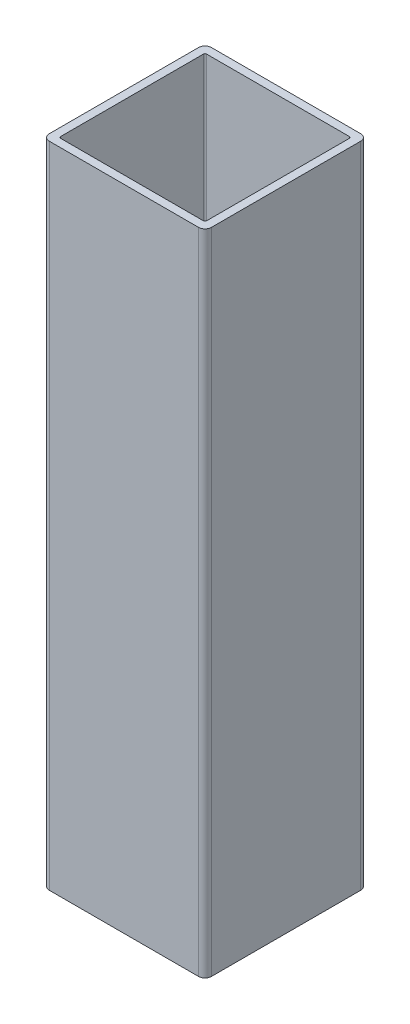
ISO-10303-21;
HEADER;
FILE_DESCRIPTION(('STEP AP214'),'2;1');
FILE_NAME('part.step','',(''),(''),'','','');
FILE_SCHEMA(('AUTOMOTIVE_DESIGN { 1 0 10303 214 1 1 1 1 }'));
ENDSEC;
DATA;
#1=APPLICATION_CONTEXT('core data for automotive mechanical design processes');
#2=APPLICATION_PROTOCOL_DEFINITION('international standard','automotive_design',2000,#1);
#3=PRODUCT_CONTEXT('',#1,'mechanical');
#4=PRODUCT('Part','Part','',(#3));
#5=PRODUCT_RELATED_PRODUCT_CATEGORY('part','',(#4));
#6=PRODUCT_DEFINITION_FORMATION('','',#4);
#7=PRODUCT_DEFINITION_CONTEXT('part definition',#1,'design');
#8=PRODUCT_DEFINITION('design','',#6,#7);
#9=PRODUCT_DEFINITION_SHAPE('','',#8);
#10=(LENGTH_UNIT() NAMED_UNIT(*) SI_UNIT(.MILLI.,.METRE.));
#11=(NAMED_UNIT(*) PLANE_ANGLE_UNIT() SI_UNIT($,.RADIAN.));
#12=(NAMED_UNIT(*) SI_UNIT($,.STERADIAN.) SOLID_ANGLE_UNIT());
#13=UNCERTAINTY_MEASURE_WITH_UNIT(LENGTH_MEASURE(1.E-05),#10,'distance_accuracy_value','');
#14=(GEOMETRIC_REPRESENTATION_CONTEXT(3) GLOBAL_UNCERTAINTY_ASSIGNED_CONTEXT((#13)) GLOBAL_UNIT_ASSIGNED_CONTEXT((#10,
#11,#12)) REPRESENTATION_CONTEXT('',''));
#15=CARTESIAN_POINT('',(0.,0.,0.));
#16=DIRECTION('',(0.,0.,1.));
#17=DIRECTION('',(1.,0.,0.));
#18=AXIS2_PLACEMENT_3D('',#15,#16,#17);
#19=CARTESIAN_POINT('',(358.3,100.,925.));
#20=DIRECTION('',(0.,1.,0.));
#21=DIRECTION('',(0.,0.,1.));
#22=AXIS2_PLACEMENT_3D('',#19,#20,#21);
#23=PLANE('',#22);
#24=DIRECTION('',(-1.,0.,0.));
#25=VECTOR('',#24,1.);
#26=CARTESIAN_POINT('',(358.3,100.,-482.5));
#27=LINE('',#26,#25);
#28=CARTESIAN_POINT('',(-364.3,100.,-482.5));
#29=VERTEX_POINT('',#28);
#30=CARTESIAN_POINT('',(-452.3,100.,-482.5));
#31=VERTEX_POINT('',#30);
#32=EDGE_CURVE('E299',#29,#31,#27,.T.);
#33=ORIENTED_EDGE('',*,*,#32,.T.);
#34=CARTESIAN_POINT('',(-452.3,100.,-481.5));
#35=DIRECTION('',(0.,1.,0.));
#36=DIRECTION('',(0.,0.,1.));
#37=AXIS2_PLACEMENT_3D('',#34,#35,#36);
#38=CIRCLE('',#37,1.);
#39=CARTESIAN_POINT('',(-453.3,100.,-481.5));
#40=VERTEX_POINT('',#39);
#41=EDGE_CURVE('E200',#31,#40,#38,.T.);
#42=ORIENTED_EDGE('',*,*,#41,.T.);
#43=DIRECTION('',(0.,0.,1.));
#44=VECTOR('',#43,1.);
#45=CARTESIAN_POINT('',(-453.3,100.,925.));
#46=LINE('',#45,#44);
#47=CARTESIAN_POINT('',(-453.3,100.,-393.5));
#48=VERTEX_POINT('',#47);
#49=EDGE_CURVE('E374',#40,#48,#46,.T.);
#50=ORIENTED_EDGE('',*,*,#49,.T.);
#51=CARTESIAN_POINT('',(-452.3,100.,-393.5));
#52=DIRECTION('',(0.,1.,0.));
#53=DIRECTION('',(0.,0.,1.));
#54=AXIS2_PLACEMENT_3D('',#51,#52,#53);
#55=CIRCLE('',#54,1.);
#56=CARTESIAN_POINT('',(-452.3,100.,-392.5));
#57=VERTEX_POINT('',#56);
#58=EDGE_CURVE('E27',#48,#57,#55,.T.);
#59=ORIENTED_EDGE('',*,*,#58,.T.);
#60=DIRECTION('',(1.,0.,0.));
#61=VECTOR('',#60,1.);
#62=CARTESIAN_POINT('',(358.3,100.,-392.5));
#63=LINE('',#62,#61);
#64=CARTESIAN_POINT('',(-364.3,100.,-392.5));
#65=VERTEX_POINT('',#64);
#66=EDGE_CURVE('E295',#57,#65,#63,.T.);
#67=ORIENTED_EDGE('',*,*,#66,.T.);
#68=CARTESIAN_POINT('',(-364.3,100.,-393.5));
#69=DIRECTION('',(0.,1.,0.));
#70=DIRECTION('',(0.,0.,1.));
#71=AXIS2_PLACEMENT_3D('',#68,#69,#70);
#72=CIRCLE('',#71,1.);
#73=CARTESIAN_POINT('',(-363.3,100.,-393.5));
#74=VERTEX_POINT('',#73);
#75=EDGE_CURVE('E34',#65,#74,#72,.T.);
#76=ORIENTED_EDGE('',*,*,#75,.T.);
#77=DIRECTION('',(0.,0.,-1.));
#78=VECTOR('',#77,1.);
#79=CARTESIAN_POINT('',(-363.3,100.,925.));
#80=LINE('',#79,#78);
#81=CARTESIAN_POINT('',(-363.3,100.,-481.5));
#82=VERTEX_POINT('',#81);
#83=EDGE_CURVE('E296',#74,#82,#80,.T.);
#84=ORIENTED_EDGE('',*,*,#83,.T.);
#85=CARTESIAN_POINT('',(-364.3,100.,-481.5));
#86=DIRECTION('',(0.,1.,0.));
#87=DIRECTION('',(0.,0.,1.));
#88=AXIS2_PLACEMENT_3D('',#85,#86,#87);
#89=CIRCLE('',#88,1.);
#90=EDGE_CURVE('E204',#82,#29,#89,.T.);
#91=ORIENTED_EDGE('',*,*,#90,.T.);
#92=EDGE_LOOP('',(#33,#42,#50,#59,#67,#76,#84,#91));
#93=FACE_BOUND('',#92,.T.);
#94=DIRECTION('',(1.,0.,0.));
#95=VECTOR('',#94,1.);
#96=CARTESIAN_POINT('',(-458.3,100.,-487.5));
#97=LINE('',#96,#95);
#98=CARTESIAN_POINT('',(-454.3,100.,-487.5));
#99=VERTEX_POINT('',#98);
#100=CARTESIAN_POINT('',(-362.3,100.,-487.5));
#101=VERTEX_POINT('',#100);
#102=EDGE_CURVE('E137',#99,#101,#97,.T.);
#103=ORIENTED_EDGE('',*,*,#102,.T.);
#104=CARTESIAN_POINT('',(-362.3,100.,-483.5));
#105=DIRECTION('',(0.,1.,0.));
#106=DIRECTION('',(0.,0.,1.));
#107=AXIS2_PLACEMENT_3D('',#104,#105,#106);
#108=CIRCLE('',#107,4.);
#109=CARTESIAN_POINT('',(-358.3,100.,-483.5));
#110=VERTEX_POINT('',#109);
#111=EDGE_CURVE('E133',#101,#110,#108,.F.);
#112=ORIENTED_EDGE('',*,*,#111,.T.);
#113=DIRECTION('',(0.,0.,1.));
#114=VECTOR('',#113,1.);
#115=CARTESIAN_POINT('',(-358.3,100.,-387.5));
#116=LINE('',#115,#114);
#117=CARTESIAN_POINT('',(-358.3,100.,-391.5));
#118=VERTEX_POINT('',#117);
#119=EDGE_CURVE('E135',#110,#118,#116,.T.);
#120=ORIENTED_EDGE('',*,*,#119,.T.);
#121=CARTESIAN_POINT('',(-362.3,100.,-391.5));
#122=DIRECTION('',(0.,1.,0.));
#123=DIRECTION('',(0.,0.,1.));
#124=AXIS2_PLACEMENT_3D('',#121,#122,#123);
#125=CIRCLE('',#124,4.);
#126=CARTESIAN_POINT('',(-362.3,100.,-387.5));
#127=VERTEX_POINT('',#126);
#128=EDGE_CURVE('E326',#118,#127,#125,.F.);
#129=ORIENTED_EDGE('',*,*,#128,.T.);
#130=DIRECTION('',(-1.,0.,0.));
#131=VECTOR('',#130,1.);
#132=CARTESIAN_POINT('',(-458.3,100.,-387.5));
#133=LINE('',#132,#131);
#134=CARTESIAN_POINT('',(-454.3,100.,-387.5));
#135=VERTEX_POINT('',#134);
#136=EDGE_CURVE('E154',#127,#135,#133,.T.);
#137=ORIENTED_EDGE('',*,*,#136,.T.);
#138=CARTESIAN_POINT('',(-454.3,100.,-391.5));
#139=DIRECTION('',(0.,1.,0.));
#140=DIRECTION('',(0.,0.,1.));
#141=AXIS2_PLACEMENT_3D('',#138,#139,#140);
#142=CIRCLE('',#141,4.);
#143=CARTESIAN_POINT('',(-458.3,100.,-391.5));
#144=VERTEX_POINT('',#143);
#145=EDGE_CURVE('E321',#135,#144,#142,.F.);
#146=ORIENTED_EDGE('',*,*,#145,.T.);
#147=DIRECTION('',(0.,0.,1.));
#148=VECTOR('',#147,1.);
#149=CARTESIAN_POINT('',(-458.3,100.,-387.5));
#150=LINE('',#149,#148);
#151=CARTESIAN_POINT('',(-458.3,100.,-483.5));
#152=VERTEX_POINT('',#151);
#153=EDGE_CURVE('E153',#152,#144,#150,.T.);
#154=ORIENTED_EDGE('',*,*,#153,.F.);
#155=CARTESIAN_POINT('',(-454.3,100.,-483.5));
#156=DIRECTION('',(0.,1.,0.));
#157=DIRECTION('',(0.,0.,1.));
#158=AXIS2_PLACEMENT_3D('',#155,#156,#157);
#159=CIRCLE('',#158,4.);
#160=EDGE_CURVE('E142',#152,#99,#159,.F.);
#161=ORIENTED_EDGE('',*,*,#160,.T.);
#162=EDGE_LOOP('',(#103,#112,#120,#129,#137,#146,#154,#161));
#163=FACE_BOUND('',#162,.T.);
#164=ADVANCED_FACE('F19',(#93,#163),#23,.F.);
#165=CARTESIAN_POINT('',(-358.3,500.,825.));
#166=DIRECTION('',(0.,-1.,0.));
#167=DIRECTION('',(0.,0.,-1.));
#168=AXIS2_PLACEMENT_3D('',#165,#166,#167);
#169=PLANE('',#168);
#170=DIRECTION('',(1.,0.,0.));
#171=VECTOR('',#170,1.);
#172=CARTESIAN_POINT('',(-358.3,500.,-482.5));
#173=LINE('',#172,#171);
#174=CARTESIAN_POINT('',(-452.3,500.,-482.5));
#175=VERTEX_POINT('',#174);
#176=CARTESIAN_POINT('',(-364.3,500.,-482.5));
#177=VERTEX_POINT('',#176);
#178=EDGE_CURVE('E270',#175,#177,#173,.T.);
#179=ORIENTED_EDGE('',*,*,#178,.T.);
#180=CARTESIAN_POINT('',(-364.3,500.,-481.5));
#181=DIRECTION('',(0.,-1.,0.));
#182=DIRECTION('',(0.,0.,-1.));
#183=AXIS2_PLACEMENT_3D('',#180,#181,#182);
#184=CIRCLE('',#183,1.);
#185=CARTESIAN_POINT('',(-363.3,500.,-481.5));
#186=VERTEX_POINT('',#185);
#187=EDGE_CURVE('E206',#177,#186,#184,.T.);
#188=ORIENTED_EDGE('',*,*,#187,.T.);
#189=DIRECTION('',(0.,0.,1.));
#190=VECTOR('',#189,1.);
#191=CARTESIAN_POINT('',(-363.3,500.,825.));
#192=LINE('',#191,#190);
#193=CARTESIAN_POINT('',(-363.3,500.,-393.5));
#194=VERTEX_POINT('',#193);
#195=EDGE_CURVE('E220',#186,#194,#192,.T.);
#196=ORIENTED_EDGE('',*,*,#195,.T.);
#197=CARTESIAN_POINT('',(-364.3,500.,-393.5));
#198=DIRECTION('',(0.,-1.,0.));
#199=DIRECTION('',(0.,0.,-1.));
#200=AXIS2_PLACEMENT_3D('',#197,#198,#199);
#201=CIRCLE('',#200,1.);
#202=CARTESIAN_POINT('',(-364.3,500.,-392.5));
#203=VERTEX_POINT('',#202);
#204=EDGE_CURVE('E209',#194,#203,#201,.T.);
#205=ORIENTED_EDGE('',*,*,#204,.T.);
#206=DIRECTION('',(-1.,0.,0.));
#207=VECTOR('',#206,1.);
#208=CARTESIAN_POINT('',(-358.3,500.,-392.5));
#209=LINE('',#208,#207);
#210=CARTESIAN_POINT('',(-452.3,500.,-392.5));
#211=VERTEX_POINT('',#210);
#212=EDGE_CURVE('E162',#203,#211,#209,.T.);
#213=ORIENTED_EDGE('',*,*,#212,.T.);
#214=CARTESIAN_POINT('',(-452.3,500.,-393.5));
#215=DIRECTION('',(0.,-1.,0.));
#216=DIRECTION('',(0.,0.,-1.));
#217=AXIS2_PLACEMENT_3D('',#214,#215,#216);
#218=CIRCLE('',#217,1.);
#219=CARTESIAN_POINT('',(-453.3,500.,-393.5));
#220=VERTEX_POINT('',#219);
#221=EDGE_CURVE('E12',#211,#220,#218,.T.);
#222=ORIENTED_EDGE('',*,*,#221,.T.);
#223=DIRECTION('',(0.,0.,-1.));
#224=VECTOR('',#223,1.);
#225=CARTESIAN_POINT('',(-453.3,500.,825.));
#226=LINE('',#225,#224);
#227=CARTESIAN_POINT('',(-453.3,500.,-481.5));
#228=VERTEX_POINT('',#227);
#229=EDGE_CURVE('E273',#220,#228,#226,.T.);
#230=ORIENTED_EDGE('',*,*,#229,.T.);
#231=CARTESIAN_POINT('',(-452.3,500.,-481.5));
#232=DIRECTION('',(0.,-1.,0.));
#233=DIRECTION('',(0.,0.,-1.));
#234=AXIS2_PLACEMENT_3D('',#231,#232,#233);
#235=CIRCLE('',#234,1.);
#236=EDGE_CURVE('E202',#228,#175,#235,.T.);
#237=ORIENTED_EDGE('',*,*,#236,.T.);
#238=EDGE_LOOP('',(#179,#188,#196,#205,#213,#222,#230,#237));
#239=FACE_BOUND('',#238,.T.);
#240=DIRECTION('',(0.,0.,1.));
#241=VECTOR('',#240,1.);
#242=CARTESIAN_POINT('',(-358.3,500.,0.));
#243=LINE('',#242,#241);
#244=CARTESIAN_POINT('',(-358.3,500.,-483.5));
#245=VERTEX_POINT('',#244);
#246=CARTESIAN_POINT('',(-358.3,500.,-391.5));
#247=VERTEX_POINT('',#246);
#248=EDGE_CURVE('E310',#245,#247,#243,.T.);
#249=ORIENTED_EDGE('',*,*,#248,.F.);
#250=CARTESIAN_POINT('',(-362.3,500.,-483.5));
#251=DIRECTION('',(0.,-1.,0.));
#252=DIRECTION('',(0.,0.,-1.));
#253=AXIS2_PLACEMENT_3D('',#250,#251,#252);
#254=CIRCLE('',#253,4.);
#255=CARTESIAN_POINT('',(-362.3,500.,-487.5));
#256=VERTEX_POINT('',#255);
#257=EDGE_CURVE('E157',#245,#256,#254,.F.);
#258=ORIENTED_EDGE('',*,*,#257,.T.);
#259=DIRECTION('',(1.,0.,0.));
#260=VECTOR('',#259,1.);
#261=CARTESIAN_POINT('',(0.,500.,-487.5));
#262=LINE('',#261,#260);
#263=CARTESIAN_POINT('',(-454.3,500.,-487.5));
#264=VERTEX_POINT('',#263);
#265=EDGE_CURVE('E304',#264,#256,#262,.T.);
#266=ORIENTED_EDGE('',*,*,#265,.F.);
#267=CARTESIAN_POINT('',(-454.3,500.,-483.5));
#268=DIRECTION('',(0.,-1.,0.));
#269=DIRECTION('',(0.,0.,-1.));
#270=AXIS2_PLACEMENT_3D('',#267,#268,#269);
#271=CIRCLE('',#270,4.);
#272=CARTESIAN_POINT('',(-458.3,500.,-483.5));
#273=VERTEX_POINT('',#272);
#274=EDGE_CURVE('E334',#264,#273,#271,.F.);
#275=ORIENTED_EDGE('',*,*,#274,.T.);
#276=DIRECTION('',(0.,0.,1.));
#277=VECTOR('',#276,1.);
#278=CARTESIAN_POINT('',(-458.3,500.,0.));
#279=LINE('',#278,#277);
#280=CARTESIAN_POINT('',(-458.3,500.,-391.5));
#281=VERTEX_POINT('',#280);
#282=EDGE_CURVE('E280',#281,#273,#279,.F.);
#283=ORIENTED_EDGE('',*,*,#282,.F.);
#284=CARTESIAN_POINT('',(-454.3,500.,-391.5));
#285=DIRECTION('',(0.,-1.,0.));
#286=DIRECTION('',(0.,0.,-1.));
#287=AXIS2_PLACEMENT_3D('',#284,#285,#286);
#288=CIRCLE('',#287,4.);
#289=CARTESIAN_POINT('',(-454.3,500.,-387.5));
#290=VERTEX_POINT('',#289);
#291=EDGE_CURVE('E160',#281,#290,#288,.F.);
#292=ORIENTED_EDGE('',*,*,#291,.T.);
#293=DIRECTION('',(1.,0.,0.));
#294=VECTOR('',#293,1.);
#295=CARTESIAN_POINT('',(0.,500.,-387.5));
#296=LINE('',#295,#294);
#297=CARTESIAN_POINT('',(-362.3,500.,-387.5));
#298=VERTEX_POINT('',#297);
#299=EDGE_CURVE('E308',#298,#290,#296,.F.);
#300=ORIENTED_EDGE('',*,*,#299,.F.);
#301=CARTESIAN_POINT('',(-362.3,500.,-391.5));
#302=DIRECTION('',(0.,-1.,0.));
#303=DIRECTION('',(0.,0.,-1.));
#304=AXIS2_PLACEMENT_3D('',#301,#302,#303);
#305=CIRCLE('',#304,4.);
#306=EDGE_CURVE('E158',#298,#247,#305,.F.);
#307=ORIENTED_EDGE('',*,*,#306,.T.);
#308=EDGE_LOOP('',(#249,#258,#266,#275,#283,#292,#300,#307));
#309=FACE_BOUND('',#308,.T.);
#310=ADVANCED_FACE('F216',(#239,#309),#169,.F.);
#311=CARTESIAN_POINT('',(-358.3,100.,-387.5));
#312=DIRECTION('',(-1.,0.,0.));
#313=DIRECTION('',(0.,0.,1.));
#314=AXIS2_PLACEMENT_3D('',#311,#312,#313);
#315=PLANE('',#314);
#316=ORIENTED_EDGE('',*,*,#119,.F.);
#317=DIRECTION('',(0.,1.,0.));
#318=VECTOR('',#317,1.);
#319=CARTESIAN_POINT('',(-358.3,100.,-483.5));
#320=LINE('',#319,#318);
#321=EDGE_CURVE('E149',#110,#245,#320,.T.);
#322=ORIENTED_EDGE('',*,*,#321,.T.);
#323=ORIENTED_EDGE('',*,*,#248,.T.);
#324=DIRECTION('',(0.,-1.,0.));
#325=VECTOR('',#324,1.);
#326=CARTESIAN_POINT('',(-358.3,100.,-391.5));
#327=LINE('',#326,#325);
#328=EDGE_CURVE('E152',#247,#118,#327,.T.);
#329=ORIENTED_EDGE('',*,*,#328,.T.);
#330=EDGE_LOOP('',(#316,#322,#323,#329));
#331=FACE_BOUND('',#330,.T.);
#332=ADVANCED_FACE('F147',(#331),#315,.F.);
#333=CARTESIAN_POINT('',(-458.3,100.,-387.5));
#334=DIRECTION('',(0.,0.,-1.));
#335=DIRECTION('',(-1.,0.,0.));
#336=AXIS2_PLACEMENT_3D('',#333,#334,#335);
#337=PLANE('',#336);
#338=ORIENTED_EDGE('',*,*,#299,.T.);
#339=DIRECTION('',(0.,-1.,0.));
#340=VECTOR('',#339,1.);
#341=CARTESIAN_POINT('',(-454.3,100.,-387.5));
#342=LINE('',#341,#340);
#343=EDGE_CURVE('E174',#290,#135,#342,.T.);
#344=ORIENTED_EDGE('',*,*,#343,.T.);
#345=ORIENTED_EDGE('',*,*,#136,.F.);
#346=DIRECTION('',(0.,-1.,0.));
#347=VECTOR('',#346,1.);
#348=CARTESIAN_POINT('',(-362.3,100.,-387.5));
#349=LINE('',#348,#347);
#350=EDGE_CURVE('E180',#127,#298,#349,.F.);
#351=ORIENTED_EDGE('',*,*,#350,.T.);
#352=EDGE_LOOP('',(#338,#344,#345,#351));
#353=FACE_BOUND('',#352,.T.);
#354=ADVANCED_FACE('F338',(#353),#337,.F.);
#355=CARTESIAN_POINT('',(-458.3,100.,-487.5));
#356=DIRECTION('',(0.,0.,1.));
#357=DIRECTION('',(1.,0.,0.));
#358=AXIS2_PLACEMENT_3D('',#355,#356,#357);
#359=PLANE('',#358);
#360=ORIENTED_EDGE('',*,*,#265,.T.);
#361=DIRECTION('',(0.,1.,0.));
#362=VECTOR('',#361,1.);
#363=CARTESIAN_POINT('',(-362.3,100.,-487.5));
#364=LINE('',#363,#362);
#365=EDGE_CURVE('E328',#256,#101,#364,.F.);
#366=ORIENTED_EDGE('',*,*,#365,.T.);
#367=ORIENTED_EDGE('',*,*,#102,.F.);
#368=DIRECTION('',(0.,1.,0.));
#369=VECTOR('',#368,1.);
#370=CARTESIAN_POINT('',(-454.3,100.,-487.5));
#371=LINE('',#370,#369);
#372=EDGE_CURVE('E329',#99,#264,#371,.T.);
#373=ORIENTED_EDGE('',*,*,#372,.T.);
#374=EDGE_LOOP('',(#360,#366,#367,#373));
#375=FACE_BOUND('',#374,.T.);
#376=ADVANCED_FACE('F343',(#375),#359,.F.);
#377=CARTESIAN_POINT('',(-458.3,100.,-387.5));
#378=DIRECTION('',(1.,0.,0.));
#379=DIRECTION('',(0.,0.,-1.));
#380=AXIS2_PLACEMENT_3D('',#377,#378,#379);
#381=PLANE('',#380);
#382=ORIENTED_EDGE('',*,*,#282,.T.);
#383=DIRECTION('',(0.,1.,0.));
#384=VECTOR('',#383,1.);
#385=CARTESIAN_POINT('',(-458.3,100.,-483.5));
#386=LINE('',#385,#384);
#387=EDGE_CURVE('E317',#273,#152,#386,.F.);
#388=ORIENTED_EDGE('',*,*,#387,.T.);
#389=ORIENTED_EDGE('',*,*,#153,.T.);
#390=DIRECTION('',(0.,-1.,0.));
#391=VECTOR('',#390,1.);
#392=CARTESIAN_POINT('',(-458.3,100.,-391.5));
#393=LINE('',#392,#391);
#394=EDGE_CURVE('E141',#144,#281,#393,.F.);
#395=ORIENTED_EDGE('',*,*,#394,.T.);
#396=EDGE_LOOP('',(#382,#388,#389,#395));
#397=FACE_BOUND('',#396,.T.);
#398=ADVANCED_FACE('F242',(#397),#381,.F.);
#399=CARTESIAN_POINT('',(-363.3,620.,-392.5));
#400=DIRECTION('',(0.,0.,1.));
#401=DIRECTION('',(1.,0.,0.));
#402=AXIS2_PLACEMENT_3D('',#399,#400,#401);
#403=PLANE('',#402);
#404=ORIENTED_EDGE('',*,*,#212,.F.);
#405=DIRECTION('',(0.,-1.,0.));
#406=VECTOR('',#405,1.);
#407=CARTESIAN_POINT('',(-364.3,100.,-392.5));
#408=LINE('',#407,#406);
#409=EDGE_CURVE('E198',#203,#65,#408,.T.);
#410=ORIENTED_EDGE('',*,*,#409,.T.);
#411=ORIENTED_EDGE('',*,*,#66,.F.);
#412=DIRECTION('',(0.,-1.,0.));
#413=VECTOR('',#412,1.);
#414=CARTESIAN_POINT('',(-452.3,500.,-392.5));
#415=LINE('',#414,#413);
#416=EDGE_CURVE('E196',#57,#211,#415,.F.);
#417=ORIENTED_EDGE('',*,*,#416,.T.);
#418=EDGE_LOOP('',(#404,#410,#411,#417));
#419=FACE_BOUND('',#418,.T.);
#420=ADVANCED_FACE('F222',(#419),#403,.F.);
#421=CARTESIAN_POINT('',(-363.3,620.,-482.5));
#422=DIRECTION('',(1.,0.,0.));
#423=DIRECTION('',(0.,0.,-1.));
#424=AXIS2_PLACEMENT_3D('',#421,#422,#423);
#425=PLANE('',#424);
#426=ORIENTED_EDGE('',*,*,#195,.F.);
#427=DIRECTION('',(0.,-1.,0.));
#428=VECTOR('',#427,1.);
#429=CARTESIAN_POINT('',(-363.3,100.,-481.5));
#430=LINE('',#429,#428);
#431=EDGE_CURVE('E193',#186,#82,#430,.T.);
#432=ORIENTED_EDGE('',*,*,#431,.T.);
#433=ORIENTED_EDGE('',*,*,#83,.F.);
#434=DIRECTION('',(0.,-1.,0.));
#435=VECTOR('',#434,1.);
#436=CARTESIAN_POINT('',(-363.3,500.,-393.5));
#437=LINE('',#436,#435);
#438=EDGE_CURVE('E191',#74,#194,#437,.F.);
#439=ORIENTED_EDGE('',*,*,#438,.T.);
#440=EDGE_LOOP('',(#426,#432,#433,#439));
#441=FACE_BOUND('',#440,.T.);
#442=ADVANCED_FACE('F359',(#441),#425,.F.);
#443=CARTESIAN_POINT('',(-453.3,620.,-482.5));
#444=DIRECTION('',(0.,0.,-1.));
#445=DIRECTION('',(-1.,0.,0.));
#446=AXIS2_PLACEMENT_3D('',#443,#444,#445);
#447=PLANE('',#446);
#448=ORIENTED_EDGE('',*,*,#178,.F.);
#449=DIRECTION('',(0.,-1.,0.));
#450=VECTOR('',#449,1.);
#451=CARTESIAN_POINT('',(-452.3,100.,-482.5));
#452=LINE('',#451,#450);
#453=EDGE_CURVE('E183',#175,#31,#452,.T.);
#454=ORIENTED_EDGE('',*,*,#453,.T.);
#455=ORIENTED_EDGE('',*,*,#32,.F.);
#456=DIRECTION('',(0.,-1.,0.));
#457=VECTOR('',#456,1.);
#458=CARTESIAN_POINT('',(-364.3,500.,-482.5));
#459=LINE('',#458,#457);
#460=EDGE_CURVE('E179',#29,#177,#459,.F.);
#461=ORIENTED_EDGE('',*,*,#460,.T.);
#462=EDGE_LOOP('',(#448,#454,#455,#461));
#463=FACE_BOUND('',#462,.T.);
#464=ADVANCED_FACE('F275',(#463),#447,.F.);
#465=CARTESIAN_POINT('',(-453.3,620.,-392.5));
#466=DIRECTION('',(-1.,0.,0.));
#467=DIRECTION('',(0.,0.,1.));
#468=AXIS2_PLACEMENT_3D('',#465,#466,#467);
#469=PLANE('',#468);
#470=ORIENTED_EDGE('',*,*,#49,.F.);
#471=DIRECTION('',(0.,-1.,0.));
#472=VECTOR('',#471,1.);
#473=CARTESIAN_POINT('',(-453.3,500.,-481.5));
#474=LINE('',#473,#472);
#475=EDGE_CURVE('E189',#40,#228,#474,.F.);
#476=ORIENTED_EDGE('',*,*,#475,.T.);
#477=ORIENTED_EDGE('',*,*,#229,.F.);
#478=DIRECTION('',(0.,-1.,0.));
#479=VECTOR('',#478,1.);
#480=CARTESIAN_POINT('',(-453.3,100.,-393.5));
#481=LINE('',#480,#479);
#482=EDGE_CURVE('E186',#220,#48,#481,.T.);
#483=ORIENTED_EDGE('',*,*,#482,.T.);
#484=EDGE_LOOP('',(#470,#476,#477,#483));
#485=FACE_BOUND('',#484,.T.);
#486=ADVANCED_FACE('F249',(#485),#469,.F.);
#487=CARTESIAN_POINT('',(-362.3,100.,-483.5));
#488=DIRECTION('',(0.,1.,0.));
#489=DIRECTION('',(0.,0.,1.));
#490=AXIS2_PLACEMENT_3D('',#487,#488,#489);
#491=CYLINDRICAL_SURFACE('',#490,4.);
#492=ORIENTED_EDGE('',*,*,#111,.F.);
#493=ORIENTED_EDGE('',*,*,#365,.F.);
#494=ORIENTED_EDGE('',*,*,#257,.F.);
#495=ORIENTED_EDGE('',*,*,#321,.F.);
#496=EDGE_LOOP('',(#492,#493,#494,#495));
#497=FACE_BOUND('',#496,.T.);
#498=ADVANCED_FACE('F156',(#497),#491,.T.);
#499=CARTESIAN_POINT('',(-454.3,100.,-483.5));
#500=DIRECTION('',(0.,1.,0.));
#501=DIRECTION('',(0.,0.,1.));
#502=AXIS2_PLACEMENT_3D('',#499,#500,#501);
#503=CYLINDRICAL_SURFACE('',#502,4.);
#504=ORIENTED_EDGE('',*,*,#160,.F.);
#505=ORIENTED_EDGE('',*,*,#387,.F.);
#506=ORIENTED_EDGE('',*,*,#274,.F.);
#507=ORIENTED_EDGE('',*,*,#372,.F.);
#508=EDGE_LOOP('',(#504,#505,#506,#507));
#509=FACE_BOUND('',#508,.T.);
#510=ADVANCED_FACE('F248',(#509),#503,.T.);
#511=CARTESIAN_POINT('',(-454.3,100.,-391.5));
#512=DIRECTION('',(0.,-1.,0.));
#513=DIRECTION('',(0.,0.,-1.));
#514=AXIS2_PLACEMENT_3D('',#511,#512,#513);
#515=CYLINDRICAL_SURFACE('',#514,4.);
#516=ORIENTED_EDGE('',*,*,#291,.F.);
#517=ORIENTED_EDGE('',*,*,#394,.F.);
#518=ORIENTED_EDGE('',*,*,#145,.F.);
#519=ORIENTED_EDGE('',*,*,#343,.F.);
#520=EDGE_LOOP('',(#516,#517,#518,#519));
#521=FACE_BOUND('',#520,.T.);
#522=ADVANCED_FACE('F252',(#521),#515,.T.);
#523=CARTESIAN_POINT('',(-362.3,100.,-391.5));
#524=DIRECTION('',(0.,-1.,0.));
#525=DIRECTION('',(0.,0.,-1.));
#526=AXIS2_PLACEMENT_3D('',#523,#524,#525);
#527=CYLINDRICAL_SURFACE('',#526,4.);
#528=ORIENTED_EDGE('',*,*,#306,.F.);
#529=ORIENTED_EDGE('',*,*,#350,.F.);
#530=ORIENTED_EDGE('',*,*,#128,.F.);
#531=ORIENTED_EDGE('',*,*,#328,.F.);
#532=EDGE_LOOP('',(#528,#529,#530,#531));
#533=FACE_BOUND('',#532,.T.);
#534=ADVANCED_FACE('F256',(#533),#527,.T.);
#535=CARTESIAN_POINT('',(-452.3,620.,-481.5));
#536=DIRECTION('',(0.,1.,0.));
#537=DIRECTION('',(0.,0.,1.));
#538=AXIS2_PLACEMENT_3D('',#535,#536,#537);
#539=CYLINDRICAL_SURFACE('',#538,1.);
#540=ORIENTED_EDGE('',*,*,#236,.F.);
#541=ORIENTED_EDGE('',*,*,#475,.F.);
#542=ORIENTED_EDGE('',*,*,#41,.F.);
#543=ORIENTED_EDGE('',*,*,#453,.F.);
#544=EDGE_LOOP('',(#540,#541,#542,#543));
#545=FACE_BOUND('',#544,.T.);
#546=ADVANCED_FACE('F233',(#545),#539,.F.);
#547=CARTESIAN_POINT('',(-364.3,620.,-481.5));
#548=DIRECTION('',(0.,1.,0.));
#549=DIRECTION('',(0.,0.,1.));
#550=AXIS2_PLACEMENT_3D('',#547,#548,#549);
#551=CYLINDRICAL_SURFACE('',#550,1.);
#552=ORIENTED_EDGE('',*,*,#187,.F.);
#553=ORIENTED_EDGE('',*,*,#460,.F.);
#554=ORIENTED_EDGE('',*,*,#90,.F.);
#555=ORIENTED_EDGE('',*,*,#431,.F.);
#556=EDGE_LOOP('',(#552,#553,#554,#555));
#557=FACE_BOUND('',#556,.T.);
#558=ADVANCED_FACE('F226',(#557),#551,.F.);
#559=CARTESIAN_POINT('',(-364.3,620.,-393.5));
#560=DIRECTION('',(0.,1.,0.));
#561=DIRECTION('',(0.,0.,1.));
#562=AXIS2_PLACEMENT_3D('',#559,#560,#561);
#563=CYLINDRICAL_SURFACE('',#562,1.);
#564=ORIENTED_EDGE('',*,*,#204,.F.);
#565=ORIENTED_EDGE('',*,*,#438,.F.);
#566=ORIENTED_EDGE('',*,*,#75,.F.);
#567=ORIENTED_EDGE('',*,*,#409,.F.);
#568=EDGE_LOOP('',(#564,#565,#566,#567));
#569=FACE_BOUND('',#568,.T.);
#570=ADVANCED_FACE('F224',(#569),#563,.F.);
#571=CARTESIAN_POINT('',(-452.3,620.,-393.5));
#572=DIRECTION('',(0.,1.,0.));
#573=DIRECTION('',(0.,0.,1.));
#574=AXIS2_PLACEMENT_3D('',#571,#572,#573);
#575=CYLINDRICAL_SURFACE('',#574,1.);
#576=ORIENTED_EDGE('',*,*,#221,.F.);
#577=ORIENTED_EDGE('',*,*,#416,.F.);
#578=ORIENTED_EDGE('',*,*,#58,.F.);
#579=ORIENTED_EDGE('',*,*,#482,.F.);
#580=EDGE_LOOP('',(#576,#577,#578,#579));
#581=FACE_BOUND('',#580,.T.);
#582=ADVANCED_FACE('F21',(#581),#575,.F.);
#583=CLOSED_SHELL('',(#164,#310,#332,#354,#376,#398,#420,#442,#464,#486,#498,#510,#522,#534,
#546,#558,#570,#582));
#584=MANIFOLD_SOLID_BREP('B1',#583);
#585=ADVANCED_BREP_SHAPE_REPRESENTATION('',(#18,#584),#14);
#586=SHAPE_DEFINITION_REPRESENTATION(#9,#585);
ENDSEC;
END-ISO-10303-21;
